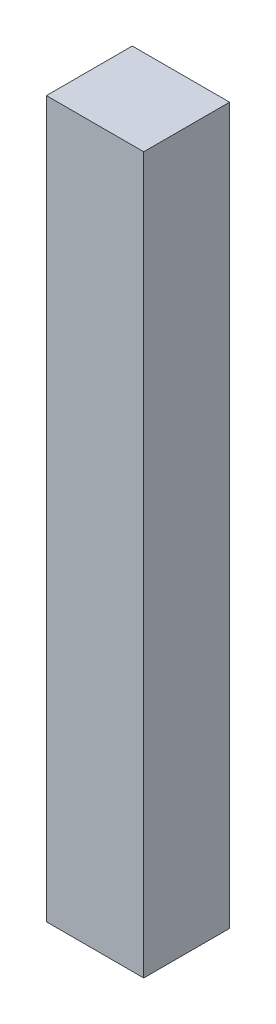
ISO-10303-21;
HEADER;
FILE_DESCRIPTION(('STEP AP214'),'2;1');
FILE_NAME('part.step','',(''),(''),'','','');
FILE_SCHEMA(('AUTOMOTIVE_DESIGN { 1 0 10303 214 1 1 1 1 }'));
ENDSEC;
DATA;
#1=APPLICATION_CONTEXT('core data for automotive mechanical design processes');
#2=APPLICATION_PROTOCOL_DEFINITION('international standard','automotive_design',2000,#1);
#3=PRODUCT_CONTEXT('',#1,'mechanical');
#4=PRODUCT('Part','Part','',(#3));
#5=PRODUCT_RELATED_PRODUCT_CATEGORY('part','',(#4));
#6=PRODUCT_DEFINITION_FORMATION('','',#4);
#7=PRODUCT_DEFINITION_CONTEXT('part definition',#1,'design');
#8=PRODUCT_DEFINITION('design','',#6,#7);
#9=PRODUCT_DEFINITION_SHAPE('','',#8);
#10=(LENGTH_UNIT() NAMED_UNIT(*) SI_UNIT(.MILLI.,.METRE.));
#11=(NAMED_UNIT(*) PLANE_ANGLE_UNIT() SI_UNIT($,.RADIAN.));
#12=(NAMED_UNIT(*) SI_UNIT($,.STERADIAN.) SOLID_ANGLE_UNIT());
#13=UNCERTAINTY_MEASURE_WITH_UNIT(LENGTH_MEASURE(1.E-05),#10,'distance_accuracy_value','');
#14=(GEOMETRIC_REPRESENTATION_CONTEXT(3) GLOBAL_UNCERTAINTY_ASSIGNED_CONTEXT((#13)) GLOBAL_UNIT_ASSIGNED_CONTEXT((#10,
#11,#12)) REPRESENTATION_CONTEXT('',''));
#15=CARTESIAN_POINT('',(0.,0.,0.));
#16=DIRECTION('',(0.,0.,1.));
#17=DIRECTION('',(1.,0.,0.));
#18=AXIS2_PLACEMENT_3D('',#15,#16,#17);
#19=CARTESIAN_POINT('',(1.7,12.5,3.));
#20=DIRECTION('',(-1.,0.,0.));
#21=DIRECTION('',(0.,-1.,0.));
#22=AXIS2_PLACEMENT_3D('',#19,#20,#21);
#23=PLANE('',#22);
#24=DIRECTION('',(0.,1.,0.));
#25=VECTOR('',#24,1.);
#26=CARTESIAN_POINT('',(1.7,12.5,0.));
#27=LINE('',#26,#25);
#28=CARTESIAN_POINT('',(1.7,-12.5,0.));
#29=VERTEX_POINT('',#28);
#30=CARTESIAN_POINT('',(1.7,12.5,0.));
#31=VERTEX_POINT('',#30);
#32=EDGE_CURVE('E113',#29,#31,#27,.T.);
#33=ORIENTED_EDGE('',*,*,#32,.T.);
#34=DIRECTION('',(0.,0.,-1.));
#35=VECTOR('',#34,1.);
#36=CARTESIAN_POINT('',(1.7,12.5,3.));
#37=LINE('',#36,#35);
#38=CARTESIAN_POINT('',(1.7,12.5,3.));
#39=VERTEX_POINT('',#38);
#40=EDGE_CURVE('E11',#39,#31,#37,.T.);
#41=ORIENTED_EDGE('',*,*,#40,.F.);
#42=DIRECTION('',(0.,1.,0.));
#43=VECTOR('',#42,1.);
#44=CARTESIAN_POINT('',(1.7,12.5,3.));
#45=LINE('',#44,#43);
#46=CARTESIAN_POINT('',(1.7,-12.5,3.));
#47=VERTEX_POINT('',#46);
#48=EDGE_CURVE('E97',#47,#39,#45,.T.);
#49=ORIENTED_EDGE('',*,*,#48,.F.);
#50=DIRECTION('',(0.,0.,-1.));
#51=VECTOR('',#50,1.);
#52=CARTESIAN_POINT('',(1.7,-12.5,3.));
#53=LINE('',#52,#51);
#54=EDGE_CURVE('E109',#47,#29,#53,.T.);
#55=ORIENTED_EDGE('',*,*,#54,.T.);
#56=EDGE_LOOP('',(#33,#41,#49,#55));
#57=FACE_BOUND('',#56,.T.);
#58=ADVANCED_FACE('F45',(#57),#23,.F.);
#59=CARTESIAN_POINT('',(-1.7,12.5,3.));
#60=DIRECTION('',(0.,-1.,0.));
#61=DIRECTION('',(0.,0.,-1.));
#62=AXIS2_PLACEMENT_3D('',#59,#60,#61);
#63=PLANE('',#62);
#64=DIRECTION('',(-1.,0.,0.));
#65=VECTOR('',#64,1.);
#66=CARTESIAN_POINT('',(-1.7,12.5,0.));
#67=LINE('',#66,#65);
#68=CARTESIAN_POINT('',(-1.7,12.5,0.));
#69=VERTEX_POINT('',#68);
#70=EDGE_CURVE('E102',#31,#69,#67,.T.);
#71=ORIENTED_EDGE('',*,*,#70,.T.);
#72=DIRECTION('',(0.,0.,-1.));
#73=VECTOR('',#72,1.);
#74=CARTESIAN_POINT('',(-1.7,12.5,3.));
#75=LINE('',#74,#73);
#76=CARTESIAN_POINT('',(-1.7,12.5,3.));
#77=VERTEX_POINT('',#76);
#78=EDGE_CURVE('E54',#77,#69,#75,.T.);
#79=ORIENTED_EDGE('',*,*,#78,.F.);
#80=DIRECTION('',(-1.,0.,0.));
#81=VECTOR('',#80,1.);
#82=CARTESIAN_POINT('',(-1.7,12.5,3.));
#83=LINE('',#82,#81);
#84=EDGE_CURVE('E92',#39,#77,#83,.T.);
#85=ORIENTED_EDGE('',*,*,#84,.F.);
#86=ORIENTED_EDGE('',*,*,#40,.T.);
#87=EDGE_LOOP('',(#71,#79,#85,#86));
#88=FACE_BOUND('',#87,.T.);
#89=ADVANCED_FACE('F101',(#88),#63,.F.);
#90=CARTESIAN_POINT('',(-1.7,12.5,3.));
#91=DIRECTION('',(1.,0.,0.));
#92=DIRECTION('',(0.,1.,0.));
#93=AXIS2_PLACEMENT_3D('',#90,#91,#92);
#94=PLANE('',#93);
#95=DIRECTION('',(0.,-1.,0.));
#96=VECTOR('',#95,1.);
#97=CARTESIAN_POINT('',(-1.7,12.5,0.));
#98=LINE('',#97,#96);
#99=CARTESIAN_POINT('',(-1.7,-12.5,0.));
#100=VERTEX_POINT('',#99);
#101=EDGE_CURVE('E79',#69,#100,#98,.T.);
#102=ORIENTED_EDGE('',*,*,#101,.T.);
#103=DIRECTION('',(0.,0.,-1.));
#104=VECTOR('',#103,1.);
#105=CARTESIAN_POINT('',(-1.7,-12.5,3.));
#106=LINE('',#105,#104);
#107=CARTESIAN_POINT('',(-1.7,-12.5,3.));
#108=VERTEX_POINT('',#107);
#109=EDGE_CURVE('E104',#108,#100,#106,.T.);
#110=ORIENTED_EDGE('',*,*,#109,.F.);
#111=DIRECTION('',(0.,-1.,0.));
#112=VECTOR('',#111,1.);
#113=CARTESIAN_POINT('',(-1.7,12.5,3.));
#114=LINE('',#113,#112);
#115=EDGE_CURVE('E95',#77,#108,#114,.T.);
#116=ORIENTED_EDGE('',*,*,#115,.F.);
#117=ORIENTED_EDGE('',*,*,#78,.T.);
#118=EDGE_LOOP('',(#102,#110,#116,#117));
#119=FACE_BOUND('',#118,.T.);
#120=ADVANCED_FACE('F105',(#119),#94,.F.);
#121=CARTESIAN_POINT('',(-1.7,-12.5,3.));
#122=DIRECTION('',(0.,1.,0.));
#123=DIRECTION('',(0.,0.,1.));
#124=AXIS2_PLACEMENT_3D('',#121,#122,#123);
#125=PLANE('',#124);
#126=DIRECTION('',(1.,0.,0.));
#127=VECTOR('',#126,1.);
#128=CARTESIAN_POINT('',(-1.7,-12.5,0.));
#129=LINE('',#128,#127);
#130=EDGE_CURVE('E85',#100,#29,#129,.T.);
#131=ORIENTED_EDGE('',*,*,#130,.T.);
#132=ORIENTED_EDGE('',*,*,#54,.F.);
#133=DIRECTION('',(1.,0.,0.));
#134=VECTOR('',#133,1.);
#135=CARTESIAN_POINT('',(-1.7,-12.5,3.));
#136=LINE('',#135,#134);
#137=EDGE_CURVE('E62',#108,#47,#136,.T.);
#138=ORIENTED_EDGE('',*,*,#137,.F.);
#139=ORIENTED_EDGE('',*,*,#109,.T.);
#140=EDGE_LOOP('',(#131,#132,#138,#139));
#141=FACE_BOUND('',#140,.T.);
#142=ADVANCED_FACE('F126',(#141),#125,.F.);
#143=CARTESIAN_POINT('',(0.,0.,3.));
#144=DIRECTION('',(0.,0.,1.));
#145=DIRECTION('',(1.,0.,0.));
#146=AXIS2_PLACEMENT_3D('',#143,#144,#145);
#147=PLANE('',#146);
#148=ORIENTED_EDGE('',*,*,#48,.T.);
#149=ORIENTED_EDGE('',*,*,#84,.T.);
#150=ORIENTED_EDGE('',*,*,#115,.T.);
#151=ORIENTED_EDGE('',*,*,#137,.T.);
#152=EDGE_LOOP('',(#148,#149,#150,#151));
#153=FACE_BOUND('',#152,.T.);
#154=ADVANCED_FACE('F93',(#153),#147,.T.);
#155=CARTESIAN_POINT('',(0.,0.,0.));
#156=DIRECTION('',(0.,0.,1.));
#157=DIRECTION('',(1.,0.,0.));
#158=AXIS2_PLACEMENT_3D('',#155,#156,#157);
#159=PLANE('',#158);
#160=ORIENTED_EDGE('',*,*,#32,.F.);
#161=ORIENTED_EDGE('',*,*,#130,.F.);
#162=ORIENTED_EDGE('',*,*,#101,.F.);
#163=ORIENTED_EDGE('',*,*,#70,.F.);
#164=EDGE_LOOP('',(#160,#161,#162,#163));
#165=FACE_BOUND('',#164,.T.);
#166=ADVANCED_FACE('F129',(#165),#159,.F.);
#167=CLOSED_SHELL('',(#58,#89,#120,#142,#154,#166));
#168=MANIFOLD_SOLID_BREP('B2',#167);
#169=ADVANCED_BREP_SHAPE_REPRESENTATION('',(#18,#168),#14);
#170=SHAPE_DEFINITION_REPRESENTATION(#9,#169);
ENDSEC;
END-ISO-10303-21;
